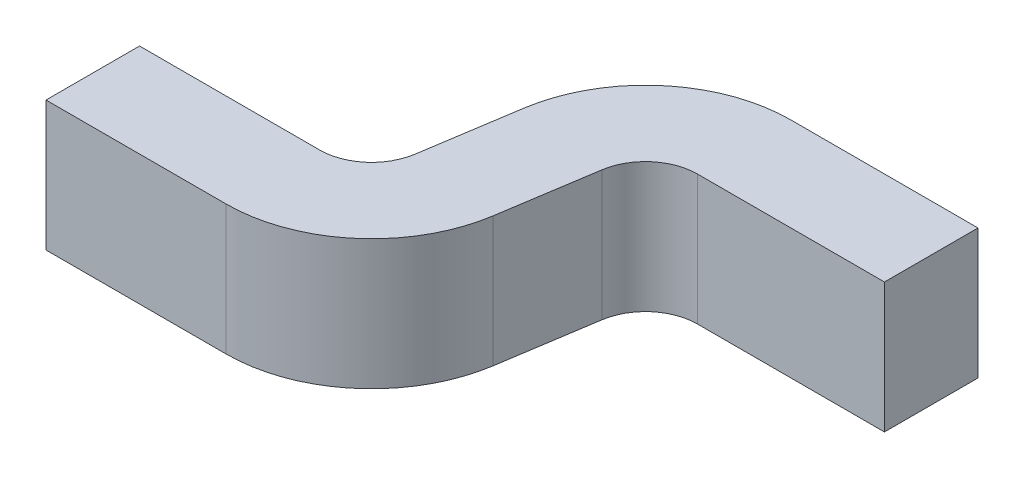
ISO-10303-21;
HEADER;
FILE_DESCRIPTION(('STEP AP214'),'2;1');
FILE_NAME('part.step','',(''),(''),'','','');
FILE_SCHEMA(('AUTOMOTIVE_DESIGN { 1 0 10303 214 1 1 1 1 }'));
ENDSEC;
DATA;
#1=APPLICATION_CONTEXT('core data for automotive mechanical design processes');
#2=APPLICATION_PROTOCOL_DEFINITION('international standard','automotive_design',2000,#1);
#3=PRODUCT_CONTEXT('',#1,'mechanical');
#4=PRODUCT('Part','Part','',(#3));
#5=PRODUCT_RELATED_PRODUCT_CATEGORY('part','',(#4));
#6=PRODUCT_DEFINITION_FORMATION('','',#4);
#7=PRODUCT_DEFINITION_CONTEXT('part definition',#1,'design');
#8=PRODUCT_DEFINITION('design','',#6,#7);
#9=PRODUCT_DEFINITION_SHAPE('','',#8);
#10=(LENGTH_UNIT() NAMED_UNIT(*) SI_UNIT(.MILLI.,.METRE.));
#11=(NAMED_UNIT(*) PLANE_ANGLE_UNIT() SI_UNIT($,.RADIAN.));
#12=(NAMED_UNIT(*) SI_UNIT($,.STERADIAN.) SOLID_ANGLE_UNIT());
#13=UNCERTAINTY_MEASURE_WITH_UNIT(LENGTH_MEASURE(1.E-05),#10,'distance_accuracy_value','');
#14=(GEOMETRIC_REPRESENTATION_CONTEXT(3) GLOBAL_UNCERTAINTY_ASSIGNED_CONTEXT((#13)) GLOBAL_UNIT_ASSIGNED_CONTEXT((#10,
#11,#12)) REPRESENTATION_CONTEXT('',''));
#15=CARTESIAN_POINT('',(0.,0.,0.));
#16=DIRECTION('',(0.,0.,1.));
#17=DIRECTION('',(1.,0.,0.));
#18=AXIS2_PLACEMENT_3D('',#15,#16,#17);
#19=CARTESIAN_POINT('',(2.840151146445,1.825,0.));
#20=DIRECTION('',(0.,0.,-1.));
#21=DIRECTION('',(0.,-1.,0.));
#22=AXIS2_PLACEMENT_3D('',#19,#20,#21);
#23=PLANE('',#22);
#24=DIRECTION('',(-1.,0.,0.));
#25=VECTOR('',#24,1.);
#26=CARTESIAN_POINT('',(2.840151146455,2.07500000001,0.));
#27=LINE('',#26,#25);
#28=CARTESIAN_POINT('',(3.2,2.075,0.));
#29=VERTEX_POINT('',#28);
#30=CARTESIAN_POINT('',(2.840151146445,2.075,0.));
#31=VERTEX_POINT('',#30);
#32=EDGE_CURVE('E11',#29,#31,#27,.T.);
#33=ORIENTED_EDGE('',*,*,#32,.F.);
#34=DIRECTION('',(0.,1.,0.));
#35=VECTOR('',#34,1.);
#36=CARTESIAN_POINT('',(3.20000000001,1.82500000001,0.));
#37=LINE('',#36,#35);
#38=CARTESIAN_POINT('',(3.2,1.825,0.));
#39=VERTEX_POINT('',#38);
#40=EDGE_CURVE('E24',#39,#29,#37,.T.);
#41=ORIENTED_EDGE('',*,*,#40,.F.);
#42=DIRECTION('',(-1.,0.,0.));
#43=VECTOR('',#42,1.);
#44=CARTESIAN_POINT('',(2.840151146455,1.82500000001,0.));
#45=LINE('',#44,#43);
#46=CARTESIAN_POINT('',(2.840151146445,1.825,0.));
#47=VERTEX_POINT('',#46);
#48=EDGE_CURVE('E203',#39,#47,#45,.T.);
#49=ORIENTED_EDGE('',*,*,#48,.T.);
#50=DIRECTION('',(0.,1.,0.));
#51=VECTOR('',#50,1.);
#52=CARTESIAN_POINT('',(2.840151146455,1.82500000001,0.));
#53=LINE('',#52,#51);
#54=EDGE_CURVE('E124',#47,#31,#53,.T.);
#55=ORIENTED_EDGE('',*,*,#54,.T.);
#56=EDGE_LOOP('',(#33,#41,#49,#55));
#57=FACE_BOUND('',#56,.T.);
#58=ADVANCED_FACE('F17',(#57),#23,.T.);
#59=CARTESIAN_POINT('',(3.2,1.825,0.));
#60=DIRECTION('',(1.,0.,0.));
#61=DIRECTION('',(0.,1.,0.));
#62=AXIS2_PLACEMENT_3D('',#59,#60,#61);
#63=PLANE('',#62);
#64=DIRECTION('',(0.,0.,-1.));
#65=VECTOR('',#64,1.);
#66=CARTESIAN_POINT('',(3.20000000001,2.07500000001,0.));
#67=LINE('',#66,#65);
#68=CARTESIAN_POINT('',(3.2,2.075,0.18));
#69=VERTEX_POINT('',#68);
#70=EDGE_CURVE('E199',#69,#29,#67,.T.);
#71=ORIENTED_EDGE('',*,*,#70,.F.);
#72=DIRECTION('',(0.,1.,0.));
#73=VECTOR('',#72,1.);
#74=CARTESIAN_POINT('',(3.20000000001,1.82500000001,0.18000000001));
#75=LINE('',#74,#73);
#76=CARTESIAN_POINT('',(3.2,1.825,0.18));
#77=VERTEX_POINT('',#76);
#78=EDGE_CURVE('E196',#77,#69,#75,.T.);
#79=ORIENTED_EDGE('',*,*,#78,.F.);
#80=DIRECTION('',(0.,0.,-1.));
#81=VECTOR('',#80,1.);
#82=CARTESIAN_POINT('',(3.20000000001,1.82500000001,0.));
#83=LINE('',#82,#81);
#84=EDGE_CURVE('E194',#77,#39,#83,.T.);
#85=ORIENTED_EDGE('',*,*,#84,.T.);
#86=ORIENTED_EDGE('',*,*,#40,.T.);
#87=EDGE_LOOP('',(#71,#79,#85,#86));
#88=FACE_BOUND('',#87,.T.);
#89=ADVANCED_FACE('F205',(#88),#63,.T.);
#90=CARTESIAN_POINT('',(2.840151146445,1.825,0.28));
#91=DIRECTION('',(0.,-1.,0.));
#92=DIRECTION('',(0.,0.,1.));
#93=AXIS2_PLACEMENT_3D('',#90,#91,#92);
#94=CYLINDRICAL_SURFACE('',#93,0.1);
#95=CARTESIAN_POINT('',(2.840151146455,2.07500000001,0.28000000001));
#96=DIRECTION('',(0.,-1.,0.));
#97=DIRECTION('',(0.,0.,-1.));
#98=AXIS2_PLACEMENT_3D('',#95,#96,#97);
#99=CIRCLE('',#98,0.1);
#100=CARTESIAN_POINT('',(2.741324776253,2.075,0.264724249455));
#101=VERTEX_POINT('',#100);
#102=CARTESIAN_POINT('',(2.840151146445,2.075,0.18));
#103=VERTEX_POINT('',#102);
#104=EDGE_CURVE('E191',#101,#103,#99,.T.);
#105=ORIENTED_EDGE('',*,*,#104,.F.);
#106=DIRECTION('',(0.,1.,0.));
#107=VECTOR('',#106,1.);
#108=CARTESIAN_POINT('',(2.741324776263,1.82500000001,0.264724249465));
#109=LINE('',#108,#107);
#110=CARTESIAN_POINT('',(2.741324776253,1.825,0.264724249455));
#111=VERTEX_POINT('',#110);
#112=EDGE_CURVE('E188',#111,#101,#109,.T.);
#113=ORIENTED_EDGE('',*,*,#112,.F.);
#114=CARTESIAN_POINT('',(2.840151146455,1.82500000001,0.28000000001));
#115=DIRECTION('',(0.,-1.,0.));
#116=DIRECTION('',(0.,0.,-1.));
#117=AXIS2_PLACEMENT_3D('',#114,#115,#116);
#118=CIRCLE('',#117,0.1);
#119=CARTESIAN_POINT('',(2.840151146445,1.825,0.18));
#120=VERTEX_POINT('',#119);
#121=EDGE_CURVE('E186',#111,#120,#118,.T.);
#122=ORIENTED_EDGE('',*,*,#121,.T.);
#123=DIRECTION('',(0.,1.,0.));
#124=VECTOR('',#123,1.);
#125=CARTESIAN_POINT('',(2.840151146455,1.82500000001,0.18000000001));
#126=LINE('',#125,#124);
#127=EDGE_CURVE('E184',#120,#103,#126,.T.);
#128=ORIENTED_EDGE('',*,*,#127,.T.);
#129=EDGE_LOOP('',(#105,#113,#122,#128));
#130=FACE_BOUND('',#129,.T.);
#131=ADVANCED_FACE('F223',(#130),#94,.F.);
#132=CARTESIAN_POINT('',(2.741324776253,1.825,0.264724249455));
#133=DIRECTION('',(0.988263701917861,0.,0.152757505450978));
#134=DIRECTION('',(0.,-1.,0.));
#135=AXIS2_PLACEMENT_3D('',#132,#133,#134);
#136=PLANE('',#135);
#137=DIRECTION('',(0.152757505458942,0.,-0.98826370191663));
#138=VECTOR('',#137,1.);
#139=CARTESIAN_POINT('',(2.741324776263,2.07500000001,0.264724249465));
#140=LINE('',#139,#138);
#141=CARTESIAN_POINT('',(2.713268486574,2.075,0.446234235617));
#142=VERTEX_POINT('',#141);
#143=EDGE_CURVE('E181',#142,#101,#140,.T.);
#144=ORIENTED_EDGE('',*,*,#143,.F.);
#145=DIRECTION('',(0.,1.,0.));
#146=VECTOR('',#145,1.);
#147=CARTESIAN_POINT('',(2.713268486584,1.82500000001,0.446234235627));
#148=LINE('',#147,#146);
#149=CARTESIAN_POINT('',(2.713268486574,1.825,0.446234235617));
#150=VERTEX_POINT('',#149);
#151=EDGE_CURVE('E178',#150,#142,#148,.T.);
#152=ORIENTED_EDGE('',*,*,#151,.F.);
#153=DIRECTION('',(0.152757505458942,0.,-0.98826370191663));
#154=VECTOR('',#153,1.);
#155=CARTESIAN_POINT('',(2.741324776263,1.82500000001,0.264724249465));
#156=LINE('',#155,#154);
#157=EDGE_CURVE('E175',#150,#111,#156,.T.);
#158=ORIENTED_EDGE('',*,*,#157,.T.);
#159=ORIENTED_EDGE('',*,*,#112,.T.);
#160=EDGE_LOOP('',(#144,#152,#158,#159));
#161=FACE_BOUND('',#160,.T.);
#162=ADVANCED_FACE('F227',(#161),#136,.T.);
#163=CARTESIAN_POINT('',(2.436554650037,1.825,0.40346213409));
#164=DIRECTION('',(0.,-1.,0.));
#165=DIRECTION('',(0.,0.,1.));
#166=AXIS2_PLACEMENT_3D('',#163,#164,#165);
#167=CYLINDRICAL_SURFACE('',#166,0.28);
#168=CARTESIAN_POINT('',(2.436554650047,2.07500000001,0.4034621341));
#169=DIRECTION('',(0.,1.,0.));
#170=DIRECTION('',(0.,0.,-1.));
#171=AXIS2_PLACEMENT_3D('',#168,#169,#170);
#172=CIRCLE('',#171,0.28);
#173=CARTESIAN_POINT('',(2.436554650037,2.075,0.68346213409));
#174=VERTEX_POINT('',#173);
#175=EDGE_CURVE('E172',#174,#142,#172,.T.);
#176=ORIENTED_EDGE('',*,*,#175,.F.);
#177=DIRECTION('',(0.,1.,0.));
#178=VECTOR('',#177,1.);
#179=CARTESIAN_POINT('',(2.436554650047,1.82500000001,0.6834621341));
#180=LINE('',#179,#178);
#181=CARTESIAN_POINT('',(2.436554650037,1.825,0.68346213409));
#182=VERTEX_POINT('',#181);
#183=EDGE_CURVE('E169',#182,#174,#180,.T.);
#184=ORIENTED_EDGE('',*,*,#183,.F.);
#185=CARTESIAN_POINT('',(2.436554650047,1.82500000001,0.4034621341));
#186=DIRECTION('',(0.,1.,0.));
#187=DIRECTION('',(0.,0.,-1.));
#188=AXIS2_PLACEMENT_3D('',#185,#186,#187);
#189=CIRCLE('',#188,0.28);
#190=EDGE_CURVE('E166',#182,#150,#189,.T.);
#191=ORIENTED_EDGE('',*,*,#190,.T.);
#192=ORIENTED_EDGE('',*,*,#151,.T.);
#193=EDGE_LOOP('',(#176,#184,#191,#192));
#194=FACE_BOUND('',#193,.T.);
#195=ADVANCED_FACE('F233',(#194),#167,.T.);
#196=CARTESIAN_POINT('',(2.090093462678,1.825,0.68346213409));
#197=DIRECTION('',(0.,0.,1.));
#198=DIRECTION('',(1.,0.,0.));
#199=AXIS2_PLACEMENT_3D('',#196,#197,#198);
#200=PLANE('',#199);
#201=DIRECTION('',(1.,0.,0.));
#202=VECTOR('',#201,1.);
#203=CARTESIAN_POINT('',(2.090093462688,2.07500000001,0.6834621341));
#204=LINE('',#203,#202);
#205=CARTESIAN_POINT('',(2.090093462678,2.075,0.68346213409));
#206=VERTEX_POINT('',#205);
#207=EDGE_CURVE('E163',#206,#174,#204,.T.);
#208=ORIENTED_EDGE('',*,*,#207,.F.);
#209=DIRECTION('',(0.,1.,0.));
#210=VECTOR('',#209,1.);
#211=CARTESIAN_POINT('',(2.090093462688,1.82500000001,0.6834621341));
#212=LINE('',#211,#210);
#213=CARTESIAN_POINT('',(2.090093462678,1.825,0.68346213409));
#214=VERTEX_POINT('',#213);
#215=EDGE_CURVE('E160',#214,#206,#212,.T.);
#216=ORIENTED_EDGE('',*,*,#215,.F.);
#217=DIRECTION('',(1.,0.,0.));
#218=VECTOR('',#217,1.);
#219=CARTESIAN_POINT('',(2.090093462688,1.82500000001,0.6834621341));
#220=LINE('',#219,#218);
#221=EDGE_CURVE('E157',#214,#182,#220,.T.);
#222=ORIENTED_EDGE('',*,*,#221,.T.);
#223=ORIENTED_EDGE('',*,*,#183,.T.);
#224=EDGE_LOOP('',(#208,#216,#222,#223));
#225=FACE_BOUND('',#224,.T.);
#226=ADVANCED_FACE('F237',(#225),#200,.T.);
#227=CARTESIAN_POINT('',(2.090093462678,1.825,0.50346213409));
#228=DIRECTION('',(-1.,0.,0.));
#229=DIRECTION('',(0.,0.,1.));
#230=AXIS2_PLACEMENT_3D('',#227,#228,#229);
#231=PLANE('',#230);
#232=DIRECTION('',(0.,0.,1.));
#233=VECTOR('',#232,1.);
#234=CARTESIAN_POINT('',(2.090093462688,2.07500000001,0.5034621341));
#235=LINE('',#234,#233);
#236=CARTESIAN_POINT('',(2.090093462678,2.075,0.50346213409));
#237=VERTEX_POINT('',#236);
#238=EDGE_CURVE('E154',#237,#206,#235,.T.);
#239=ORIENTED_EDGE('',*,*,#238,.F.);
#240=DIRECTION('',(0.,1.,0.));
#241=VECTOR('',#240,1.);
#242=CARTESIAN_POINT('',(2.090093462688,1.82500000001,0.5034621341));
#243=LINE('',#242,#241);
#244=CARTESIAN_POINT('',(2.090093462678,1.825,0.50346213409));
#245=VERTEX_POINT('',#244);
#246=EDGE_CURVE('E151',#245,#237,#243,.T.);
#247=ORIENTED_EDGE('',*,*,#246,.F.);
#248=DIRECTION('',(0.,0.,1.));
#249=VECTOR('',#248,1.);
#250=CARTESIAN_POINT('',(2.090093462688,1.82500000001,0.5034621341));
#251=LINE('',#250,#249);
#252=EDGE_CURVE('E148',#245,#214,#251,.T.);
#253=ORIENTED_EDGE('',*,*,#252,.T.);
#254=ORIENTED_EDGE('',*,*,#215,.T.);
#255=EDGE_LOOP('',(#239,#247,#253,#254));
#256=FACE_BOUND('',#255,.T.);
#257=ADVANCED_FACE('F241',(#256),#231,.T.);
#258=CARTESIAN_POINT('',(2.090093462678,1.825,0.50346213409));
#259=DIRECTION('',(0.,0.,-1.));
#260=DIRECTION('',(-1.,0.,0.));
#261=AXIS2_PLACEMENT_3D('',#258,#259,#260);
#262=PLANE('',#261);
#263=DIRECTION('',(-1.,0.,0.));
#264=VECTOR('',#263,1.);
#265=CARTESIAN_POINT('',(2.090093462688,2.07500000001,0.5034621341));
#266=LINE('',#265,#264);
#267=CARTESIAN_POINT('',(2.436554650037,2.075,0.50346213409));
#268=VERTEX_POINT('',#267);
#269=EDGE_CURVE('E145',#268,#237,#266,.T.);
#270=ORIENTED_EDGE('',*,*,#269,.F.);
#271=DIRECTION('',(0.,1.,0.));
#272=VECTOR('',#271,1.);
#273=CARTESIAN_POINT('',(2.436554650047,1.82500000001,0.5034621341));
#274=LINE('',#273,#272);
#275=CARTESIAN_POINT('',(2.436554650037,1.825,0.50346213409));
#276=VERTEX_POINT('',#275);
#277=EDGE_CURVE('E142',#276,#268,#274,.T.);
#278=ORIENTED_EDGE('',*,*,#277,.F.);
#279=DIRECTION('',(-1.,0.,0.));
#280=VECTOR('',#279,1.);
#281=CARTESIAN_POINT('',(2.090093462688,1.82500000001,0.5034621341));
#282=LINE('',#281,#280);
#283=EDGE_CURVE('E139',#276,#245,#282,.T.);
#284=ORIENTED_EDGE('',*,*,#283,.T.);
#285=ORIENTED_EDGE('',*,*,#246,.T.);
#286=EDGE_LOOP('',(#270,#278,#284,#285));
#287=FACE_BOUND('',#286,.T.);
#288=ADVANCED_FACE('F245',(#287),#262,.T.);
#289=CARTESIAN_POINT('',(2.436554650037,1.825,0.40346213409));
#290=DIRECTION('',(0.,-1.,0.));
#291=DIRECTION('',(0.,0.,1.));
#292=AXIS2_PLACEMENT_3D('',#289,#290,#291);
#293=CYLINDRICAL_SURFACE('',#292,0.1);
#294=CARTESIAN_POINT('',(2.436554650047,2.07500000001,0.4034621341));
#295=DIRECTION('',(0.,-1.,0.));
#296=DIRECTION('',(0.,0.,-1.));
#297=AXIS2_PLACEMENT_3D('',#294,#295,#296);
#298=CIRCLE('',#297,0.1);
#299=CARTESIAN_POINT('',(2.535381020228,2.075,0.418737884636));
#300=VERTEX_POINT('',#299);
#301=EDGE_CURVE('E136',#300,#268,#298,.T.);
#302=ORIENTED_EDGE('',*,*,#301,.F.);
#303=DIRECTION('',(0.,1.,0.));
#304=VECTOR('',#303,1.);
#305=CARTESIAN_POINT('',(2.535381020238,1.82500000001,0.418737884646));
#306=LINE('',#305,#304);
#307=CARTESIAN_POINT('',(2.535381020228,1.825,0.418737884636));
#308=VERTEX_POINT('',#307);
#309=EDGE_CURVE('E134',#308,#300,#306,.T.);
#310=ORIENTED_EDGE('',*,*,#309,.F.);
#311=CARTESIAN_POINT('',(2.436554650047,1.82500000001,0.4034621341));
#312=DIRECTION('',(0.,-1.,0.));
#313=DIRECTION('',(0.,0.,-1.));
#314=AXIS2_PLACEMENT_3D('',#311,#312,#313);
#315=CIRCLE('',#314,0.1);
#316=EDGE_CURVE('E121',#308,#276,#315,.T.);
#317=ORIENTED_EDGE('',*,*,#316,.T.);
#318=ORIENTED_EDGE('',*,*,#277,.T.);
#319=EDGE_LOOP('',(#302,#310,#317,#318));
#320=FACE_BOUND('',#319,.T.);
#321=ADVANCED_FACE('F249',(#320),#293,.F.);
#322=CARTESIAN_POINT('',(2.535381020228,1.825,0.418737884636));
#323=DIRECTION('',(-0.988263701917861,0.,-0.152757505450978));
#324=DIRECTION('',(-0.152757505450978,0.,0.988263701917861));
#325=AXIS2_PLACEMENT_3D('',#322,#323,#324);
#326=PLANE('',#325);
#327=DIRECTION('',(-0.152757505458942,0.,0.98826370191663));
#328=VECTOR('',#327,1.);
#329=CARTESIAN_POINT('',(2.535381020238,2.07500000001,0.418737884646));
#330=LINE('',#329,#328);
#331=CARTESIAN_POINT('',(2.563437309908,2.075,0.237227898474));
#332=VERTEX_POINT('',#331);
#333=EDGE_CURVE('E107',#332,#300,#330,.T.);
#334=ORIENTED_EDGE('',*,*,#333,.F.);
#335=DIRECTION('',(0.,1.,0.));
#336=VECTOR('',#335,1.);
#337=CARTESIAN_POINT('',(2.563437309918,1.82500000001,0.237227898484));
#338=LINE('',#337,#336);
#339=CARTESIAN_POINT('',(2.563437309908,1.825,0.237227898474));
#340=VERTEX_POINT('',#339);
#341=EDGE_CURVE('E100',#340,#332,#338,.T.);
#342=ORIENTED_EDGE('',*,*,#341,.F.);
#343=DIRECTION('',(-0.152757505458942,0.,0.98826370191663));
#344=VECTOR('',#343,1.);
#345=CARTESIAN_POINT('',(2.535381020238,1.82500000001,0.418737884646));
#346=LINE('',#345,#344);
#347=EDGE_CURVE('E104',#340,#308,#346,.T.);
#348=ORIENTED_EDGE('',*,*,#347,.T.);
#349=ORIENTED_EDGE('',*,*,#309,.T.);
#350=EDGE_LOOP('',(#334,#342,#348,#349));
#351=FACE_BOUND('',#350,.T.);
#352=ADVANCED_FACE('F102',(#351),#326,.T.);
#353=CARTESIAN_POINT('',(2.840151146445,1.825,0.28));
#354=DIRECTION('',(0.,-1.,0.));
#355=DIRECTION('',(0.,0.,-1.));
#356=AXIS2_PLACEMENT_3D('',#353,#354,#355);
#357=PLANE('',#356);
#358=CARTESIAN_POINT('',(2.840151146455,1.82500000001,0.28000000001));
#359=DIRECTION('',(0.,1.,0.));
#360=DIRECTION('',(0.,0.,-1.));
#361=AXIS2_PLACEMENT_3D('',#358,#359,#360);
#362=CIRCLE('',#361,0.28);
#363=EDGE_CURVE('E117',#47,#340,#362,.T.);
#364=ORIENTED_EDGE('',*,*,#363,.F.);
#365=ORIENTED_EDGE('',*,*,#48,.F.);
#366=ORIENTED_EDGE('',*,*,#84,.F.);
#367=DIRECTION('',(1.,0.,0.));
#368=VECTOR('',#367,1.);
#369=CARTESIAN_POINT('',(2.840151146455,1.82500000001,0.18000000001));
#370=LINE('',#369,#368);
#371=EDGE_CURVE('E125',#120,#77,#370,.T.);
#372=ORIENTED_EDGE('',*,*,#371,.F.);
#373=ORIENTED_EDGE('',*,*,#121,.F.);
#374=ORIENTED_EDGE('',*,*,#157,.F.);
#375=ORIENTED_EDGE('',*,*,#190,.F.);
#376=ORIENTED_EDGE('',*,*,#221,.F.);
#377=ORIENTED_EDGE('',*,*,#252,.F.);
#378=ORIENTED_EDGE('',*,*,#283,.F.);
#379=ORIENTED_EDGE('',*,*,#316,.F.);
#380=ORIENTED_EDGE('',*,*,#347,.F.);
#381=EDGE_LOOP('',(#364,#365,#366,#372,#373,#374,#375,#376,#377,#378,#379,#380));
#382=FACE_BOUND('',#381,.T.);
#383=ADVANCED_FACE('F115',(#382),#357,.T.);
#384=CARTESIAN_POINT('',(2.840151146445,2.075,0.28));
#385=DIRECTION('',(0.,-1.,0.));
#386=DIRECTION('',(0.,0.,-1.));
#387=AXIS2_PLACEMENT_3D('',#384,#385,#386);
#388=PLANE('',#387);
#389=CARTESIAN_POINT('',(2.840151146455,2.07500000001,0.28000000001));
#390=DIRECTION('',(0.,1.,0.));
#391=DIRECTION('',(0.,0.,-1.));
#392=AXIS2_PLACEMENT_3D('',#389,#390,#391);
#393=CIRCLE('',#392,0.28);
#394=EDGE_CURVE('E128',#31,#332,#393,.T.);
#395=ORIENTED_EDGE('',*,*,#394,.T.);
#396=ORIENTED_EDGE('',*,*,#333,.T.);
#397=ORIENTED_EDGE('',*,*,#301,.T.);
#398=ORIENTED_EDGE('',*,*,#269,.T.);
#399=ORIENTED_EDGE('',*,*,#238,.T.);
#400=ORIENTED_EDGE('',*,*,#207,.T.);
#401=ORIENTED_EDGE('',*,*,#175,.T.);
#402=ORIENTED_EDGE('',*,*,#143,.T.);
#403=ORIENTED_EDGE('',*,*,#104,.T.);
#404=DIRECTION('',(1.,0.,0.));
#405=VECTOR('',#404,1.);
#406=CARTESIAN_POINT('',(2.840151146455,2.07500000001,0.18000000001));
#407=LINE('',#406,#405);
#408=EDGE_CURVE('E211',#103,#69,#407,.T.);
#409=ORIENTED_EDGE('',*,*,#408,.T.);
#410=ORIENTED_EDGE('',*,*,#70,.T.);
#411=ORIENTED_EDGE('',*,*,#32,.T.);
#412=EDGE_LOOP('',(#395,#396,#397,#398,#399,#400,#401,#402,#403,#409,#410,#411));
#413=FACE_BOUND('',#412,.T.);
#414=ADVANCED_FACE('F209',(#413),#388,.F.);
#415=CARTESIAN_POINT('',(2.840151146445,1.825,0.28));
#416=DIRECTION('',(0.,-1.,0.));
#417=DIRECTION('',(0.,0.,1.));
#418=AXIS2_PLACEMENT_3D('',#415,#416,#417);
#419=CYLINDRICAL_SURFACE('',#418,0.28);
#420=ORIENTED_EDGE('',*,*,#394,.F.);
#421=ORIENTED_EDGE('',*,*,#54,.F.);
#422=ORIENTED_EDGE('',*,*,#363,.T.);
#423=ORIENTED_EDGE('',*,*,#341,.T.);
#424=EDGE_LOOP('',(#420,#421,#422,#423));
#425=FACE_BOUND('',#424,.T.);
#426=ADVANCED_FACE('F123',(#425),#419,.T.);
#427=CARTESIAN_POINT('',(2.840151146445,1.825,0.18));
#428=DIRECTION('',(0.,0.,1.));
#429=DIRECTION('',(1.,0.,0.));
#430=AXIS2_PLACEMENT_3D('',#427,#428,#429);
#431=PLANE('',#430);
#432=ORIENTED_EDGE('',*,*,#408,.F.);
#433=ORIENTED_EDGE('',*,*,#127,.F.);
#434=ORIENTED_EDGE('',*,*,#371,.T.);
#435=ORIENTED_EDGE('',*,*,#78,.T.);
#436=EDGE_LOOP('',(#432,#433,#434,#435));
#437=FACE_BOUND('',#436,.T.);
#438=ADVANCED_FACE('F215',(#437),#431,.T.);
#439=CLOSED_SHELL('',(#58,#89,#131,#162,#195,#226,#257,#288,#321,#352,#383,#414,#426,#438));
#440=MANIFOLD_SOLID_BREP('B1',#439);
#441=ADVANCED_BREP_SHAPE_REPRESENTATION('',(#18,#440),#14);
#442=SHAPE_DEFINITION_REPRESENTATION(#9,#441);
ENDSEC;
END-ISO-10303-21;
